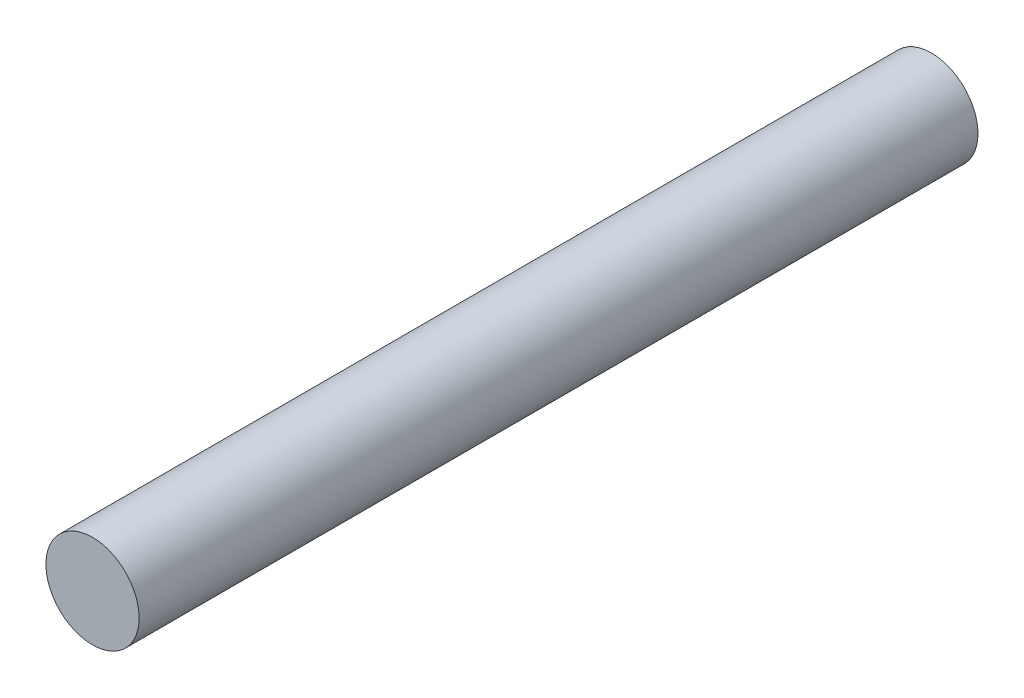
ISO-10303-21;
HEADER;
FILE_DESCRIPTION(('STEP AP214'),'2;1');
FILE_NAME('part.step','',(''),(''),'','','');
FILE_SCHEMA(('AUTOMOTIVE_DESIGN { 1 0 10303 214 1 1 1 1 }'));
ENDSEC;
DATA;
#1=APPLICATION_CONTEXT('core data for automotive mechanical design processes');
#2=APPLICATION_PROTOCOL_DEFINITION('international standard','automotive_design',2000,#1);
#3=PRODUCT_CONTEXT('',#1,'mechanical');
#4=PRODUCT('Part','Part','',(#3));
#5=PRODUCT_RELATED_PRODUCT_CATEGORY('part','',(#4));
#6=PRODUCT_DEFINITION_FORMATION('','',#4);
#7=PRODUCT_DEFINITION_CONTEXT('part definition',#1,'design');
#8=PRODUCT_DEFINITION('design','',#6,#7);
#9=PRODUCT_DEFINITION_SHAPE('','',#8);
#10=(LENGTH_UNIT() NAMED_UNIT(*) SI_UNIT(.MILLI.,.METRE.));
#11=(NAMED_UNIT(*) PLANE_ANGLE_UNIT() SI_UNIT($,.RADIAN.));
#12=(NAMED_UNIT(*) SI_UNIT($,.STERADIAN.) SOLID_ANGLE_UNIT());
#13=UNCERTAINTY_MEASURE_WITH_UNIT(LENGTH_MEASURE(1.E-05),#10,'distance_accuracy_value','');
#14=(GEOMETRIC_REPRESENTATION_CONTEXT(3) GLOBAL_UNCERTAINTY_ASSIGNED_CONTEXT((#13)) GLOBAL_UNIT_ASSIGNED_CONTEXT((#10,
#11,#12)) REPRESENTATION_CONTEXT('',''));
#15=CARTESIAN_POINT('',(0.,0.,0.));
#16=DIRECTION('',(0.,0.,1.));
#17=DIRECTION('',(1.,0.,0.));
#18=AXIS2_PLACEMENT_3D('',#15,#16,#17);
#19=CARTESIAN_POINT('',(0.,0.,-90.));
#20=DIRECTION('',(0.,0.,1.));
#21=DIRECTION('',(1.,0.,0.));
#22=AXIS2_PLACEMENT_3D('',#19,#20,#21);
#23=CYLINDRICAL_SURFACE('',#22,5.);
#24=CARTESIAN_POINT('',(0.,0.,-90.));
#25=DIRECTION('',(0.,0.,1.));
#26=DIRECTION('',(1.,0.,0.));
#27=AXIS2_PLACEMENT_3D('',#24,#25,#26);
#28=CIRCLE('',#27,5.);
#29=CARTESIAN_POINT('',(5.,0.,-90.));
#30=VERTEX_POINT('',#29);
#31=EDGE_CURVE('E10',#30,#30,#28,.T.);
#32=CARTESIAN_POINT('',(0.,0.,0.));
#33=DIRECTION('',(0.,0.,1.));
#34=DIRECTION('',(1.,0.,0.));
#35=AXIS2_PLACEMENT_3D('',#32,#33,#34);
#36=CIRCLE('',#35,5.);
#37=CARTESIAN_POINT('',(5.,0.,0.));
#38=VERTEX_POINT('',#37);
#39=EDGE_CURVE('E34',#38,#38,#36,.T.);
#40=CARTESIAN_POINT('',(5.,0.,-90.));
#41=CARTESIAN_POINT('',(5.,0.,-89.0625));
#42=CARTESIAN_POINT('',(5.,0.,-88.125));
#43=CARTESIAN_POINT('',(5.,0.,-86.25));
#44=CARTESIAN_POINT('',(5.,0.,-85.3125));
#45=CARTESIAN_POINT('',(5.,0.,-83.4375));
#46=CARTESIAN_POINT('',(5.,0.,-82.5));
#47=CARTESIAN_POINT('',(5.,0.,-80.625));
#48=CARTESIAN_POINT('',(5.,0.,-79.6875));
#49=CARTESIAN_POINT('',(5.,0.,-77.8125));
#50=CARTESIAN_POINT('',(5.,0.,-76.875));
#51=CARTESIAN_POINT('',(5.,0.,-75.));
#52=CARTESIAN_POINT('',(5.,0.,-74.0625));
#53=CARTESIAN_POINT('',(5.,0.,-72.1875));
#54=CARTESIAN_POINT('',(5.,0.,-71.25));
#55=CARTESIAN_POINT('',(5.,0.,-69.375));
#56=CARTESIAN_POINT('',(5.,0.,-68.4375));
#57=CARTESIAN_POINT('',(5.,0.,-66.5625));
#58=CARTESIAN_POINT('',(5.,0.,-65.625));
#59=CARTESIAN_POINT('',(5.,0.,-63.75));
#60=CARTESIAN_POINT('',(5.,0.,-62.8125));
#61=CARTESIAN_POINT('',(5.,0.,-60.9375));
#62=CARTESIAN_POINT('',(5.,0.,-60.));
#63=CARTESIAN_POINT('',(5.,0.,-58.125));
#64=CARTESIAN_POINT('',(5.,0.,-57.1875));
#65=CARTESIAN_POINT('',(5.,0.,-55.3125));
#66=CARTESIAN_POINT('',(5.,0.,-54.375));
#67=CARTESIAN_POINT('',(5.,0.,-52.5));
#68=CARTESIAN_POINT('',(5.,0.,-51.5625));
#69=CARTESIAN_POINT('',(5.,0.,-49.6875));
#70=CARTESIAN_POINT('',(5.,0.,-48.75));
#71=CARTESIAN_POINT('',(5.,0.,-46.875));
#72=CARTESIAN_POINT('',(5.,0.,-45.9375));
#73=CARTESIAN_POINT('',(5.,0.,-44.0625));
#74=CARTESIAN_POINT('',(5.,0.,-43.125));
#75=CARTESIAN_POINT('',(5.,0.,-41.25));
#76=CARTESIAN_POINT('',(5.,0.,-40.3125));
#77=CARTESIAN_POINT('',(5.,0.,-38.4375));
#78=CARTESIAN_POINT('',(5.,0.,-37.5));
#79=CARTESIAN_POINT('',(5.,0.,-35.625));
#80=CARTESIAN_POINT('',(5.,0.,-34.6875));
#81=CARTESIAN_POINT('',(5.,0.,-32.8125));
#82=CARTESIAN_POINT('',(5.,0.,-31.875));
#83=CARTESIAN_POINT('',(5.,0.,-30.));
#84=CARTESIAN_POINT('',(5.,0.,-29.0625));
#85=CARTESIAN_POINT('',(5.,0.,-27.1875));
#86=CARTESIAN_POINT('',(5.,0.,-26.25));
#87=CARTESIAN_POINT('',(5.,0.,-24.375));
#88=CARTESIAN_POINT('',(5.,0.,-23.4375));
#89=CARTESIAN_POINT('',(5.,0.,-21.5625));
#90=CARTESIAN_POINT('',(5.,0.,-20.625));
#91=CARTESIAN_POINT('',(5.,0.,-18.75));
#92=CARTESIAN_POINT('',(5.,0.,-17.8125));
#93=CARTESIAN_POINT('',(5.,0.,-15.9375));
#94=CARTESIAN_POINT('',(5.,0.,-15.));
#95=CARTESIAN_POINT('',(5.,0.,-13.125));
#96=CARTESIAN_POINT('',(5.,0.,-12.1875));
#97=CARTESIAN_POINT('',(5.,0.,-10.3125));
#98=CARTESIAN_POINT('',(5.,0.,-9.37500000000001));
#99=CARTESIAN_POINT('',(5.,0.,-7.50000000000002));
#100=CARTESIAN_POINT('',(5.,0.,-6.56250000000002));
#101=CARTESIAN_POINT('',(5.,0.,-4.68750000000002));
#102=CARTESIAN_POINT('',(5.,0.,-3.75000000000001));
#103=CARTESIAN_POINT('',(5.,0.,-1.87500000000001));
#104=CARTESIAN_POINT('',(5.,0.,-0.937500000000014));
#105=CARTESIAN_POINT('',(5.,0.,0.));
#106=B_SPLINE_CURVE_WITH_KNOTS('',3,(#40,#41,#42,#43,#44,#45,#46,#47,#48,#49,#50,#51,#52,#53,
#54,#55,#56,#57,#58,#59,#60,#61,#62,#63,#64,#65,#66,#67,#68,#69,#70,#71,#72,#73,#74,#75,#76,#77,
#78,#79,#80,#81,#82,#83,#84,#85,#86,#87,#88,#89,#90,#91,#92,#93,#94,#95,#96,#97,#98,#99,#100,
#101,#102,#103,#104,#105),.UNSPECIFIED.,.F.,.F.,(4,2,2,2,2,2,2,2,2,2,2,2,2,2,2,2,2,2,2,2,2,2,2,
2,2,2,2,2,2,2,2,2,4),(0.,2.81250000000001,5.62500000000001,8.4375,11.25,14.0625,16.875,19.6875,
22.5,25.3125,28.125,30.9375,33.75,36.5625,39.375,42.1875,45.,47.8125,50.625,53.4375,56.25,
59.0625,61.875,64.6875,67.5,70.3125,73.125,75.9375,78.75,81.5625,84.375,87.1875,90.),.UNSPECIFIED.);
#107=EDGE_CURVE('BSEAM31',#30,#38,#106,.T.);
#108=ORIENTED_EDGE('',*,*,#31,.T.);
#109=ORIENTED_EDGE('',*,*,#39,.F.);
#110=ORIENTED_EDGE('',*,*,#107,.T.);
#111=ORIENTED_EDGE('',*,*,#107,.F.);
#112=EDGE_LOOP('',(#108,#110,#109,#111));
#113=FACE_BOUND('',#112,.T.);
#114=ADVANCED_FACE('F31',(#113),#23,.T.);
#115=CARTESIAN_POINT('',(0.,0.,-90.));
#116=DIRECTION('',(0.,0.,1.));
#117=DIRECTION('',(1.,0.,0.));
#118=AXIS2_PLACEMENT_3D('',#115,#116,#117);
#119=PLANE('',#118);
#120=ORIENTED_EDGE('',*,*,#31,.F.);
#121=EDGE_LOOP('',(#120));
#122=FACE_BOUND('',#121,.T.);
#123=ADVANCED_FACE('F46',(#122),#119,.F.);
#124=CARTESIAN_POINT('',(0.,0.,0.));
#125=DIRECTION('',(0.,0.,1.));
#126=DIRECTION('',(1.,0.,0.));
#127=AXIS2_PLACEMENT_3D('',#124,#125,#126);
#128=PLANE('',#127);
#129=ORIENTED_EDGE('',*,*,#39,.T.);
#130=EDGE_LOOP('',(#129));
#131=FACE_BOUND('',#130,.T.);
#132=ADVANCED_FACE('F43',(#131),#128,.T.);
#133=CLOSED_SHELL('',(#114,#123,#132));
#134=MANIFOLD_SOLID_BREP('B2',#133);
#135=ADVANCED_BREP_SHAPE_REPRESENTATION('',(#18,#134),#14);
#136=SHAPE_DEFINITION_REPRESENTATION(#9,#135);
ENDSEC;
END-ISO-10303-21;
